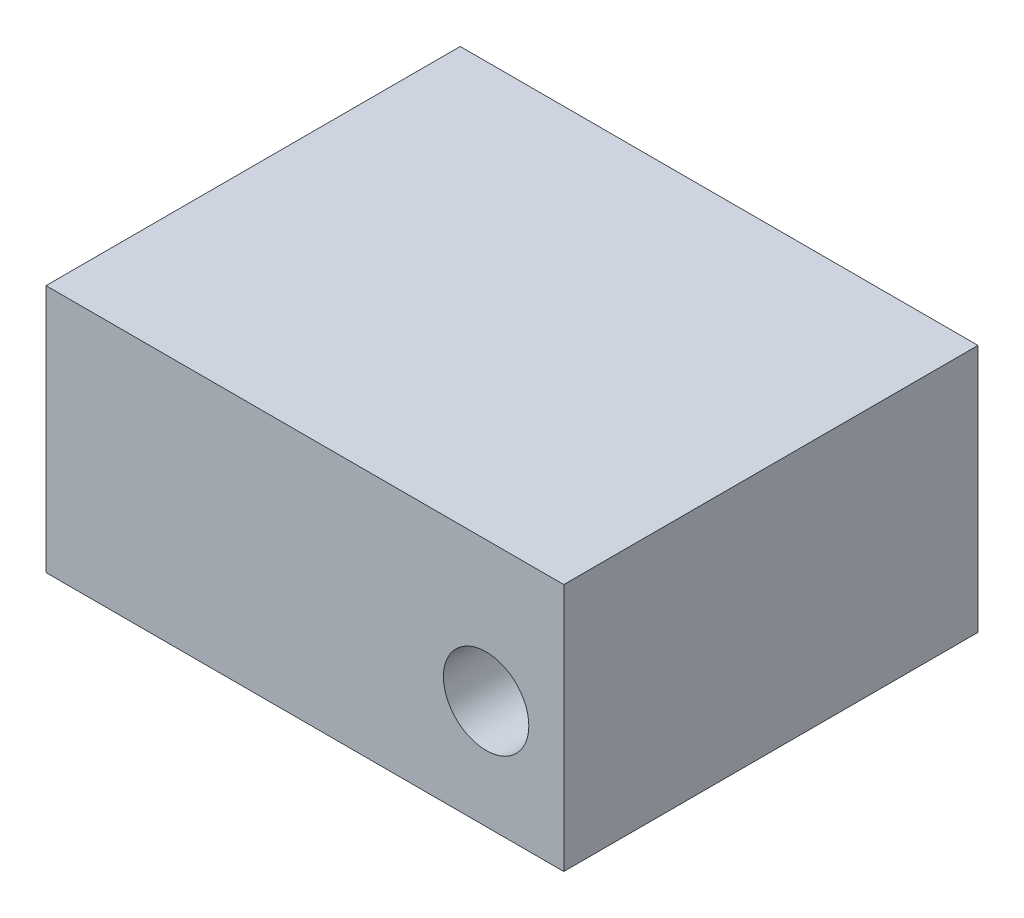
ISO-10303-21;
HEADER;
FILE_DESCRIPTION(('STEP AP214'),'2;1');
FILE_NAME('part.step','',(''),(''),'','','');
FILE_SCHEMA(('AUTOMOTIVE_DESIGN { 1 0 10303 214 1 1 1 1 }'));
ENDSEC;
DATA;
#1=APPLICATION_CONTEXT('core data for automotive mechanical design processes');
#2=APPLICATION_PROTOCOL_DEFINITION('international standard','automotive_design',2000,#1);
#3=PRODUCT_CONTEXT('',#1,'mechanical');
#4=PRODUCT('Part','Part','',(#3));
#5=PRODUCT_RELATED_PRODUCT_CATEGORY('part','',(#4));
#6=PRODUCT_DEFINITION_FORMATION('','',#4);
#7=PRODUCT_DEFINITION_CONTEXT('part definition',#1,'design');
#8=PRODUCT_DEFINITION('design','',#6,#7);
#9=PRODUCT_DEFINITION_SHAPE('','',#8);
#10=(LENGTH_UNIT() NAMED_UNIT(*) SI_UNIT(.MILLI.,.METRE.));
#11=(NAMED_UNIT(*) PLANE_ANGLE_UNIT() SI_UNIT($,.RADIAN.));
#12=(NAMED_UNIT(*) SI_UNIT($,.STERADIAN.) SOLID_ANGLE_UNIT());
#13=UNCERTAINTY_MEASURE_WITH_UNIT(LENGTH_MEASURE(1.E-05),#10,'distance_accuracy_value','');
#14=(GEOMETRIC_REPRESENTATION_CONTEXT(3) GLOBAL_UNCERTAINTY_ASSIGNED_CONTEXT((#13)) GLOBAL_UNIT_ASSIGNED_CONTEXT((#10,
#11,#12)) REPRESENTATION_CONTEXT('',''));
#15=CARTESIAN_POINT('',(0.,0.,0.));
#16=DIRECTION('',(0.,0.,1.));
#17=DIRECTION('',(1.,0.,0.));
#18=AXIS2_PLACEMENT_3D('',#15,#16,#17);
#19=CARTESIAN_POINT('',(0.,-5.15252631260981,44.2797983311254));
#20=DIRECTION('',(0.,1.,0.));
#21=DIRECTION('',(-1.,0.,0.));
#22=AXIS2_PLACEMENT_3D('',#19,#20,#21);
#23=PLANE('',#22);
#24=DIRECTION('',(-1.,0.,0.));
#25=VECTOR('',#24,1.);
#26=CARTESIAN_POINT('',(0.,-5.15252631260981,60.2797983311254));
#27=LINE('',#26,#25);
#28=CARTESIAN_POINT('',(23.9999999999997,-5.15252631260981,60.2797983311254));
#29=VERTEX_POINT('',#28);
#30=CARTESIAN_POINT('',(3.99999999999972,-5.15252631260981,60.2797983311254));
#31=VERTEX_POINT('',#30);
#32=EDGE_CURVE('E112',#29,#31,#27,.T.);
#33=ORIENTED_EDGE('',*,*,#32,.F.);
#34=DIRECTION('',(0.,0.,1.));
#35=VECTOR('',#34,1.);
#36=CARTESIAN_POINT('',(23.9999999999997,-5.15252631260981,44.2797983311254));
#37=LINE('',#36,#35);
#38=CARTESIAN_POINT('',(23.9999999999997,-5.15252631260981,44.2797983311254));
#39=VERTEX_POINT('',#38);
#40=EDGE_CURVE('E11',#39,#29,#37,.T.);
#41=ORIENTED_EDGE('',*,*,#40,.F.);
#42=DIRECTION('',(-1.,0.,0.));
#43=VECTOR('',#42,1.);
#44=CARTESIAN_POINT('',(0.,-5.15252631260981,44.2797983311254));
#45=LINE('',#44,#43);
#46=CARTESIAN_POINT('',(3.99999999999972,-5.15252631260981,44.2797983311254));
#47=VERTEX_POINT('',#46);
#48=EDGE_CURVE('E102',#39,#47,#45,.T.);
#49=ORIENTED_EDGE('',*,*,#48,.T.);
#50=DIRECTION('',(0.,0.,1.));
#51=VECTOR('',#50,1.);
#52=CARTESIAN_POINT('',(3.99999999999972,-5.15252631260981,44.2797983311254));
#53=LINE('',#52,#51);
#54=EDGE_CURVE('E47',#47,#31,#53,.T.);
#55=ORIENTED_EDGE('',*,*,#54,.T.);
#56=EDGE_LOOP('',(#33,#41,#49,#55));
#57=FACE_BOUND('',#56,.T.);
#58=ADVANCED_FACE('F43',(#57),#23,.T.);
#59=CARTESIAN_POINT('',(23.9999999999997,0.,44.2797983311254));
#60=DIRECTION('',(1.,0.,0.));
#61=DIRECTION('',(0.,0.,-1.));
#62=AXIS2_PLACEMENT_3D('',#59,#60,#61);
#63=PLANE('',#62);
#64=DIRECTION('',(0.,1.,0.));
#65=VECTOR('',#64,1.);
#66=CARTESIAN_POINT('',(23.9999999999997,0.,60.2797983311254));
#67=LINE('',#66,#65);
#68=CARTESIAN_POINT('',(23.9999999999997,-14.7525263126098,60.2797983311254));
#69=VERTEX_POINT('',#68);
#70=EDGE_CURVE('E118',#69,#29,#67,.T.);
#71=ORIENTED_EDGE('',*,*,#70,.F.);
#72=DIRECTION('',(0.,0.,1.));
#73=VECTOR('',#72,1.);
#74=CARTESIAN_POINT('',(23.9999999999997,-14.7525263126098,44.2797983311254));
#75=LINE('',#74,#73);
#76=CARTESIAN_POINT('',(23.9999999999997,-14.7525263126098,44.2797983311254));
#77=VERTEX_POINT('',#76);
#78=EDGE_CURVE('E53',#77,#69,#75,.T.);
#79=ORIENTED_EDGE('',*,*,#78,.F.);
#80=DIRECTION('',(0.,1.,0.));
#81=VECTOR('',#80,1.);
#82=CARTESIAN_POINT('',(23.9999999999997,0.,44.2797983311254));
#83=LINE('',#82,#81);
#84=EDGE_CURVE('E95',#77,#39,#83,.T.);
#85=ORIENTED_EDGE('',*,*,#84,.T.);
#86=ORIENTED_EDGE('',*,*,#40,.T.);
#87=EDGE_LOOP('',(#71,#79,#85,#86));
#88=FACE_BOUND('',#87,.T.);
#89=ADVANCED_FACE('F133',(#88),#63,.T.);
#90=CARTESIAN_POINT('',(0.,-14.7525263126098,44.2797983311254));
#91=DIRECTION('',(0.,1.,0.));
#92=DIRECTION('',(0.,0.,1.));
#93=AXIS2_PLACEMENT_3D('',#90,#91,#92);
#94=PLANE('',#93);
#95=DIRECTION('',(-1.,0.,0.));
#96=VECTOR('',#95,1.);
#97=CARTESIAN_POINT('',(0.,-14.7525263126098,60.2797983311254));
#98=LINE('',#97,#96);
#99=CARTESIAN_POINT('',(3.99999999999972,-14.7525263126098,60.2797983311254));
#100=VERTEX_POINT('',#99);
#101=EDGE_CURVE('E99',#69,#100,#98,.T.);
#102=ORIENTED_EDGE('',*,*,#101,.T.);
#103=DIRECTION('',(0.,0.,1.));
#104=VECTOR('',#103,1.);
#105=CARTESIAN_POINT('',(3.99999999999972,-14.7525263126098,44.2797983311254));
#106=LINE('',#105,#104);
#107=CARTESIAN_POINT('',(3.99999999999972,-14.7525263126098,44.2797983311254));
#108=VERTEX_POINT('',#107);
#109=EDGE_CURVE('E97',#108,#100,#106,.T.);
#110=ORIENTED_EDGE('',*,*,#109,.F.);
#111=DIRECTION('',(-1.,0.,0.));
#112=VECTOR('',#111,1.);
#113=CARTESIAN_POINT('',(0.,-14.7525263126098,44.2797983311254));
#114=LINE('',#113,#112);
#115=EDGE_CURVE('E91',#77,#108,#114,.T.);
#116=ORIENTED_EDGE('',*,*,#115,.F.);
#117=ORIENTED_EDGE('',*,*,#78,.T.);
#118=EDGE_LOOP('',(#102,#110,#116,#117));
#119=FACE_BOUND('',#118,.T.);
#120=ADVANCED_FACE('F98',(#119),#94,.F.);
#121=CARTESIAN_POINT('',(20.9999999993997,-10.5525259878278,44.2797983311254));
#122=DIRECTION('',(0.,0.,1.));
#123=DIRECTION('',(1.,0.,0.));
#124=AXIS2_PLACEMENT_3D('',#121,#122,#123);
#125=CYLINDRICAL_SURFACE('',#124,1.65);
#126=CARTESIAN_POINT('',(20.9999999993997,-10.5525259878278,44.2797983311254));
#127=DIRECTION('',(0.,0.,1.));
#128=DIRECTION('',(1.,0.,0.));
#129=AXIS2_PLACEMENT_3D('',#126,#127,#128);
#130=CIRCLE('',#129,1.65);
#131=CARTESIAN_POINT('',(22.6499999993997,-10.5525259878278,44.2797983311254));
#132=VERTEX_POINT('',#131);
#133=EDGE_CURVE('E104',#132,#132,#130,.T.);
#134=ORIENTED_EDGE('',*,*,#133,.F.);
#135=EDGE_LOOP('',(#134));
#136=FACE_BOUND('',#135,.T.);
#137=CARTESIAN_POINT('',(20.9999999993997,-10.5525259878278,60.2797983311254));
#138=DIRECTION('',(0.,0.,1.));
#139=DIRECTION('',(1.,0.,0.));
#140=AXIS2_PLACEMENT_3D('',#137,#138,#139);
#141=CIRCLE('',#140,1.65);
#142=CARTESIAN_POINT('',(22.6499999993997,-10.5525259878278,60.2797983311254));
#143=VERTEX_POINT('',#142);
#144=EDGE_CURVE('E109',#143,#143,#141,.T.);
#145=ORIENTED_EDGE('',*,*,#144,.T.);
#146=EDGE_LOOP('',(#145));
#147=FACE_BOUND('',#146,.T.);
#148=ADVANCED_FACE('F45',(#136,#147),#125,.F.);
#149=CARTESIAN_POINT('',(3.99999999999972,0.,44.2797983311254));
#150=DIRECTION('',(-1.,0.,0.));
#151=DIRECTION('',(0.,-1.,0.));
#152=AXIS2_PLACEMENT_3D('',#149,#150,#151);
#153=PLANE('',#152);
#154=DIRECTION('',(0.,-1.,0.));
#155=VECTOR('',#154,1.);
#156=CARTESIAN_POINT('',(3.99999999999972,0.,60.2797983311254));
#157=LINE('',#156,#155);
#158=EDGE_CURVE('E115',#31,#100,#157,.T.);
#159=ORIENTED_EDGE('',*,*,#158,.F.);
#160=ORIENTED_EDGE('',*,*,#54,.F.);
#161=DIRECTION('',(0.,-1.,0.));
#162=VECTOR('',#161,1.);
#163=CARTESIAN_POINT('',(3.99999999999972,0.,44.2797983311254));
#164=LINE('',#163,#162);
#165=EDGE_CURVE('E94',#47,#108,#164,.T.);
#166=ORIENTED_EDGE('',*,*,#165,.T.);
#167=ORIENTED_EDGE('',*,*,#109,.T.);
#168=EDGE_LOOP('',(#159,#160,#166,#167));
#169=FACE_BOUND('',#168,.T.);
#170=ADVANCED_FACE('F101',(#169),#153,.T.);
#171=CARTESIAN_POINT('',(0.,0.,44.2797983311254));
#172=DIRECTION('',(0.,0.,1.));
#173=DIRECTION('',(1.,0.,0.));
#174=AXIS2_PLACEMENT_3D('',#171,#172,#173);
#175=PLANE('',#174);
#176=ORIENTED_EDGE('',*,*,#133,.T.);
#177=EDGE_LOOP('',(#176));
#178=FACE_BOUND('',#177,.T.);
#179=ORIENTED_EDGE('',*,*,#48,.F.);
#180=ORIENTED_EDGE('',*,*,#84,.F.);
#181=ORIENTED_EDGE('',*,*,#115,.T.);
#182=ORIENTED_EDGE('',*,*,#165,.F.);
#183=EDGE_LOOP('',(#179,#180,#181,#182));
#184=FACE_BOUND('',#183,.T.);
#185=ADVANCED_FACE('F93',(#178,#184),#175,.F.);
#186=CARTESIAN_POINT('',(0.,0.,60.2797983311254));
#187=DIRECTION('',(0.,0.,1.));
#188=DIRECTION('',(1.,0.,0.));
#189=AXIS2_PLACEMENT_3D('',#186,#187,#188);
#190=PLANE('',#189);
#191=ORIENTED_EDGE('',*,*,#144,.F.);
#192=EDGE_LOOP('',(#191));
#193=FACE_BOUND('',#192,.T.);
#194=ORIENTED_EDGE('',*,*,#32,.T.);
#195=ORIENTED_EDGE('',*,*,#158,.T.);
#196=ORIENTED_EDGE('',*,*,#101,.F.);
#197=ORIENTED_EDGE('',*,*,#70,.T.);
#198=EDGE_LOOP('',(#194,#195,#196,#197));
#199=FACE_BOUND('',#198,.T.);
#200=ADVANCED_FACE('F130',(#193,#199),#190,.T.);
#201=CLOSED_SHELL('',(#58,#89,#120,#148,#170,#185,#200));
#202=MANIFOLD_SOLID_BREP('B2',#201);
#203=ADVANCED_BREP_SHAPE_REPRESENTATION('',(#18,#202),#14);
#204=SHAPE_DEFINITION_REPRESENTATION(#9,#203);
ENDSEC;
END-ISO-10303-21;
